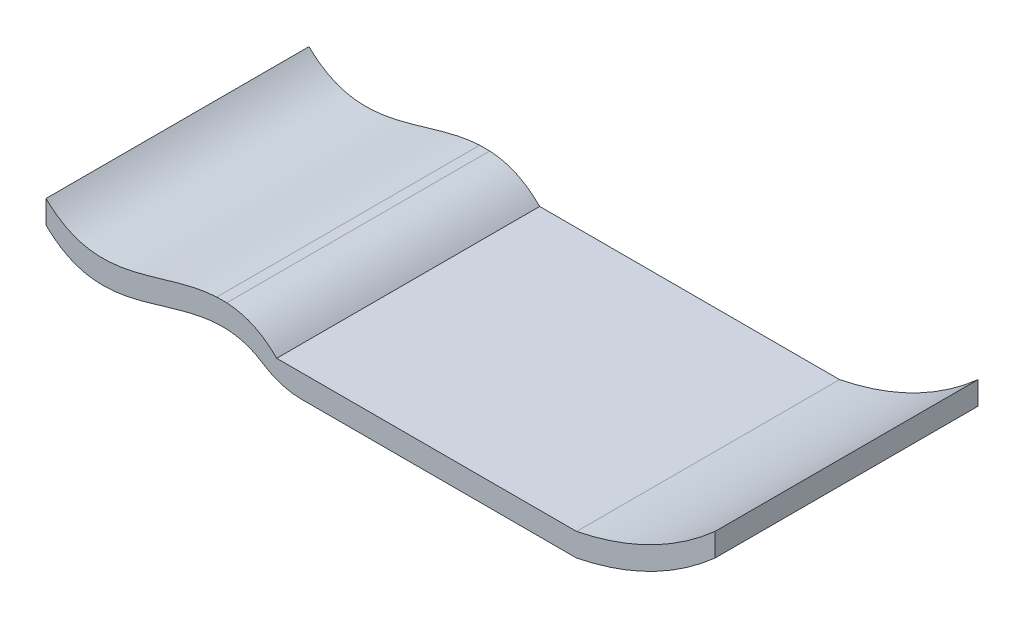
ISO-10303-21;
HEADER;
FILE_DESCRIPTION(('STEP AP214'),'2;1');
FILE_NAME('part.step','',(''),(''),'','','');
FILE_SCHEMA(('AUTOMOTIVE_DESIGN { 1 0 10303 214 1 1 1 1 }'));
ENDSEC;
DATA;
#1=APPLICATION_CONTEXT('core data for automotive mechanical design processes');
#2=APPLICATION_PROTOCOL_DEFINITION('international standard','automotive_design',2000,#1);
#3=PRODUCT_CONTEXT('',#1,'mechanical');
#4=PRODUCT('Part','Part','',(#3));
#5=PRODUCT_RELATED_PRODUCT_CATEGORY('part','',(#4));
#6=PRODUCT_DEFINITION_FORMATION('','',#4);
#7=PRODUCT_DEFINITION_CONTEXT('part definition',#1,'design');
#8=PRODUCT_DEFINITION('design','',#6,#7);
#9=PRODUCT_DEFINITION_SHAPE('','',#8);
#10=(LENGTH_UNIT() NAMED_UNIT(*) SI_UNIT(.MILLI.,.METRE.));
#11=(NAMED_UNIT(*) PLANE_ANGLE_UNIT() SI_UNIT($,.RADIAN.));
#12=(NAMED_UNIT(*) SI_UNIT($,.STERADIAN.) SOLID_ANGLE_UNIT());
#13=UNCERTAINTY_MEASURE_WITH_UNIT(LENGTH_MEASURE(1.E-05),#10,'distance_accuracy_value','');
#14=(GEOMETRIC_REPRESENTATION_CONTEXT(3) GLOBAL_UNCERTAINTY_ASSIGNED_CONTEXT((#13)) GLOBAL_UNIT_ASSIGNED_CONTEXT((#10,
#11,#12)) REPRESENTATION_CONTEXT('',''));
#15=CARTESIAN_POINT('',(0.,0.,0.));
#16=DIRECTION('',(0.,0.,1.));
#17=DIRECTION('',(1.,0.,0.));
#18=AXIS2_PLACEMENT_3D('',#15,#16,#17);
#19=CARTESIAN_POINT('',(0.,-5.,57.));
#20=CARTESIAN_POINT('',(-14.7624301242813,10.34831620414,57.));
#21=CARTESIAN_POINT('',(-34.295343774997,-15.48284378012,57.));
#22=CARTESIAN_POINT('',(-50.,0.,57.));
#23=B_SPLINE_CURVE_WITH_KNOTS('',3,(#19,#20,#21,#22),.UNSPECIFIED.,.F.,.F.,(4,4),(0.,1.),.UNSPECIFIED.);
#24=DIRECTION('',(0.,0.,-1.));
#25=VECTOR('',#24,1.);
#26=SURFACE_OF_LINEAR_EXTRUSION('',#23,#25);
#27=CARTESIAN_POINT('',(0.,-5.,0.));
#28=CARTESIAN_POINT('',(-14.7624301242813,10.34831620414,0.));
#29=CARTESIAN_POINT('',(-34.295343774997,-15.48284378012,0.));
#30=CARTESIAN_POINT('',(-50.,0.,0.));
#31=B_SPLINE_CURVE_WITH_KNOTS('',3,(#27,#28,#29,#30),.UNSPECIFIED.,.F.,.F.,(4,4),(0.,1.),.UNSPECIFIED.);
#32=CARTESIAN_POINT('',(-2.98901661872686,-2.471313430449,0.));
#33=VERTEX_POINT('',#32);
#34=CARTESIAN_POINT('',(-50.,0.,0.));
#35=VERTEX_POINT('',#34);
#36=EDGE_CURVE('E211',#33,#35,#31,.T.);
#37=ORIENTED_EDGE('',*,*,#36,.F.);
#38=DIRECTION('',(0.,0.,-1.));
#39=VECTOR('',#38,1.);
#40=CARTESIAN_POINT('',(-2.98901661872712,-2.47131343044883,0.));
#41=LINE('',#40,#39);
#42=CARTESIAN_POINT('',(-2.98901661872686,-2.471313430449,57.));
#43=VERTEX_POINT('',#42);
#44=EDGE_CURVE('E50',#33,#43,#41,.F.);
#45=ORIENTED_EDGE('',*,*,#44,.T.);
#46=CARTESIAN_POINT('',(-50.,0.,57.));
#47=VERTEX_POINT('',#46);
#48=EDGE_CURVE('E133',#43,#47,#23,.T.);
#49=ORIENTED_EDGE('',*,*,#48,.T.);
#50=DIRECTION('',(0.,0.,-1.));
#51=VECTOR('',#50,1.);
#52=CARTESIAN_POINT('',(-50.,0.,57.));
#53=LINE('',#52,#51);
#54=EDGE_CURVE('E188',#47,#35,#53,.T.);
#55=ORIENTED_EDGE('',*,*,#54,.T.);
#56=EDGE_LOOP('',(#37,#45,#49,#55));
#57=FACE_BOUND('',#56,.T.);
#58=ADVANCED_FACE('F42',(#57),#26,.T.);
#59=CARTESIAN_POINT('',(0.,-5.,57.));
#60=DIRECTION('',(0.,1.,0.));
#61=DIRECTION('',(0.,0.,1.));
#62=AXIS2_PLACEMENT_3D('',#59,#60,#61);
#63=PLANE('',#62);
#64=DIRECTION('',(1.,0.,0.));
#65=VECTOR('',#64,1.);
#66=CARTESIAN_POINT('',(0.,-5.,57.));
#67=LINE('',#66,#65);
#68=CARTESIAN_POINT('',(5.34563042356007,-5.,57.));
#69=VERTEX_POINT('',#68);
#70=CARTESIAN_POINT('',(65.,-5.,57.));
#71=VERTEX_POINT('',#70);
#72=EDGE_CURVE('E122',#69,#71,#67,.T.);
#73=ORIENTED_EDGE('',*,*,#72,.F.);
#74=DIRECTION('',(0.,0.,1.));
#75=VECTOR('',#74,1.);
#76=CARTESIAN_POINT('',(5.34563042356007,-5.,0.));
#77=LINE('',#76,#75);
#78=CARTESIAN_POINT('',(5.34563042356007,-5.,0.));
#79=VERTEX_POINT('',#78);
#80=EDGE_CURVE('E142',#69,#79,#77,.F.);
#81=ORIENTED_EDGE('',*,*,#80,.T.);
#82=DIRECTION('',(1.,0.,0.));
#83=VECTOR('',#82,1.);
#84=CARTESIAN_POINT('',(0.,-5.,0.));
#85=LINE('',#84,#83);
#86=CARTESIAN_POINT('',(65.,-5.,0.));
#87=VERTEX_POINT('',#86);
#88=EDGE_CURVE('E138',#79,#87,#85,.T.);
#89=ORIENTED_EDGE('',*,*,#88,.T.);
#90=DIRECTION('',(0.,0.,-1.));
#91=VECTOR('',#90,1.);
#92=CARTESIAN_POINT('',(65.,-5.,57.));
#93=LINE('',#92,#91);
#94=EDGE_CURVE('E136',#71,#87,#93,.T.);
#95=ORIENTED_EDGE('',*,*,#94,.F.);
#96=EDGE_LOOP('',(#73,#81,#89,#95));
#97=FACE_BOUND('',#96,.T.);
#98=ADVANCED_FACE('F137',(#97),#63,.F.);
#99=CARTESIAN_POINT('',(65.,-5.,57.));
#100=CARTESIAN_POINT('',(81.9733805434408,-1.5348515337873,57.));
#101=CARTESIAN_POINT('',(95.,10.,57.));
#102=B_SPLINE_CURVE_WITH_KNOTS('',2,(#99,#100,#101),.UNSPECIFIED.,.F.,.F.,(3,3),(0.,1.),.UNSPECIFIED.);
#103=DIRECTION('',(0.,0.,-1.));
#104=VECTOR('',#103,1.);
#105=SURFACE_OF_LINEAR_EXTRUSION('',#102,#104);
#106=CARTESIAN_POINT('',(65.,-5.,0.));
#107=CARTESIAN_POINT('',(81.9733805434408,-1.5348515337873,0.));
#108=CARTESIAN_POINT('',(95.,10.,0.));
#109=B_SPLINE_CURVE_WITH_KNOTS('',2,(#106,#107,#108),.UNSPECIFIED.,.F.,.F.,(3,3),(0.,1.),.UNSPECIFIED.);
#110=CARTESIAN_POINT('',(95.,10.,0.));
#111=VERTEX_POINT('',#110);
#112=EDGE_CURVE('E210',#87,#111,#109,.T.);
#113=ORIENTED_EDGE('',*,*,#112,.T.);
#114=DIRECTION('',(0.,0.,-1.));
#115=VECTOR('',#114,1.);
#116=CARTESIAN_POINT('',(95.,10.,57.));
#117=LINE('',#116,#115);
#118=CARTESIAN_POINT('',(95.,10.,57.));
#119=VERTEX_POINT('',#118);
#120=EDGE_CURVE('E143',#119,#111,#117,.T.);
#121=ORIENTED_EDGE('',*,*,#120,.F.);
#122=EDGE_CURVE('E127',#71,#119,#102,.T.);
#123=ORIENTED_EDGE('',*,*,#122,.F.);
#124=ORIENTED_EDGE('',*,*,#94,.T.);
#125=EDGE_LOOP('',(#113,#121,#123,#124));
#126=FACE_BOUND('',#125,.T.);
#127=ADVANCED_FACE('F145',(#126),#105,.F.);
#128=CARTESIAN_POINT('',(95.,0.,57.));
#129=DIRECTION('',(1.,0.,0.));
#130=DIRECTION('',(0.,0.,-1.));
#131=AXIS2_PLACEMENT_3D('',#128,#129,#130);
#132=PLANE('',#131);
#133=DIRECTION('',(0.,-1.,0.));
#134=VECTOR('',#133,1.);
#135=CARTESIAN_POINT('',(95.,0.,0.));
#136=LINE('',#135,#134);
#137=CARTESIAN_POINT('',(95.,15.,0.));
#138=VERTEX_POINT('',#137);
#139=EDGE_CURVE('E213',#138,#111,#136,.T.);
#140=ORIENTED_EDGE('',*,*,#139,.F.);
#141=DIRECTION('',(0.,0.,-1.));
#142=VECTOR('',#141,1.);
#143=CARTESIAN_POINT('',(95.,15.,57.));
#144=LINE('',#143,#142);
#145=CARTESIAN_POINT('',(95.,15.,57.));
#146=VERTEX_POINT('',#145);
#147=EDGE_CURVE('E203',#146,#138,#144,.T.);
#148=ORIENTED_EDGE('',*,*,#147,.F.);
#149=DIRECTION('',(0.,-1.,0.));
#150=VECTOR('',#149,1.);
#151=CARTESIAN_POINT('',(95.,0.,57.));
#152=LINE('',#151,#150);
#153=EDGE_CURVE('E147',#146,#119,#152,.T.);
#154=ORIENTED_EDGE('',*,*,#153,.T.);
#155=ORIENTED_EDGE('',*,*,#120,.T.);
#156=EDGE_LOOP('',(#140,#148,#154,#155));
#157=FACE_BOUND('',#156,.T.);
#158=ADVANCED_FACE('F163',(#157),#132,.T.);
#159=CARTESIAN_POINT('',(65.,0.,57.));
#160=CARTESIAN_POINT('',(81.9733805434408,3.4651484662127,57.));
#161=CARTESIAN_POINT('',(95.,15.,57.));
#162=B_SPLINE_CURVE_WITH_KNOTS('',2,(#159,#160,#161),.UNSPECIFIED.,.F.,.F.,(3,3),(0.,1.),.UNSPECIFIED.);
#163=DIRECTION('',(0.,0.,-1.));
#164=VECTOR('',#163,1.);
#165=SURFACE_OF_LINEAR_EXTRUSION('',#162,#164);
#166=CARTESIAN_POINT('',(65.,0.,0.));
#167=CARTESIAN_POINT('',(81.9733805434408,3.4651484662127,0.));
#168=CARTESIAN_POINT('',(95.,15.,0.));
#169=B_SPLINE_CURVE_WITH_KNOTS('',2,(#166,#167,#168),.UNSPECIFIED.,.F.,.F.,(3,3),(0.,1.),.UNSPECIFIED.);
#170=CARTESIAN_POINT('',(65.,0.,0.));
#171=VERTEX_POINT('',#170);
#172=EDGE_CURVE('E226',#171,#138,#169,.T.);
#173=ORIENTED_EDGE('',*,*,#172,.F.);
#174=DIRECTION('',(0.,0.,-1.));
#175=VECTOR('',#174,1.);
#176=CARTESIAN_POINT('',(65.,0.,57.));
#177=LINE('',#176,#175);
#178=CARTESIAN_POINT('',(65.,0.,57.));
#179=VERTEX_POINT('',#178);
#180=EDGE_CURVE('E201',#179,#171,#177,.T.);
#181=ORIENTED_EDGE('',*,*,#180,.F.);
#182=EDGE_CURVE('E149',#179,#146,#162,.T.);
#183=ORIENTED_EDGE('',*,*,#182,.T.);
#184=ORIENTED_EDGE('',*,*,#147,.T.);
#185=EDGE_LOOP('',(#173,#181,#183,#184));
#186=FACE_BOUND('',#185,.T.);
#187=ADVANCED_FACE('F279',(#186),#165,.T.);
#188=CARTESIAN_POINT('',(0.,0.,57.));
#189=DIRECTION('',(0.,1.,0.));
#190=DIRECTION('',(0.,0.,1.));
#191=AXIS2_PLACEMENT_3D('',#188,#189,#190);
#192=PLANE('',#191);
#193=DIRECTION('',(1.,0.,0.));
#194=VECTOR('',#193,1.);
#195=CARTESIAN_POINT('',(0.,0.,0.));
#196=LINE('',#195,#194);
#197=CARTESIAN_POINT('',(0.,0.,0.));
#198=VERTEX_POINT('',#197);
#199=EDGE_CURVE('E231',#198,#171,#196,.T.);
#200=ORIENTED_EDGE('',*,*,#199,.F.);
#201=DIRECTION('',(0.,0.,-1.));
#202=VECTOR('',#201,1.);
#203=CARTESIAN_POINT('',(0.,0.,57.));
#204=LINE('',#203,#202);
#205=CARTESIAN_POINT('',(0.,0.,57.));
#206=VERTEX_POINT('',#205);
#207=EDGE_CURVE('E199',#206,#198,#204,.T.);
#208=ORIENTED_EDGE('',*,*,#207,.F.);
#209=DIRECTION('',(1.,0.,0.));
#210=VECTOR('',#209,1.);
#211=CARTESIAN_POINT('',(0.,0.,57.));
#212=LINE('',#211,#210);
#213=EDGE_CURVE('E265',#206,#179,#212,.T.);
#214=ORIENTED_EDGE('',*,*,#213,.T.);
#215=ORIENTED_EDGE('',*,*,#180,.T.);
#216=EDGE_LOOP('',(#200,#208,#214,#215));
#217=FACE_BOUND('',#216,.T.);
#218=ADVANCED_FACE('F277',(#217),#192,.T.);
#219=CARTESIAN_POINT('',(0.,0.,57.));
#220=CARTESIAN_POINT('',(-15.0428525056975,15.1501864439706,57.));
#221=CARTESIAN_POINT('',(-34.3267970058822,-10.2469348174445,57.));
#222=CARTESIAN_POINT('',(-50.,5.,57.));
#223=B_SPLINE_CURVE_WITH_KNOTS('',3,(#219,#220,#221,#222),.UNSPECIFIED.,.F.,.F.,(4,4),(0.,1.),.UNSPECIFIED.);
#224=DIRECTION('',(0.,0.,-1.));
#225=VECTOR('',#224,1.);
#226=SURFACE_OF_LINEAR_EXTRUSION('',#223,#225);
#227=CARTESIAN_POINT('',(0.,0.,0.));
#228=CARTESIAN_POINT('',(-15.0428525056975,15.1501864439706,0.));
#229=CARTESIAN_POINT('',(-34.3267970058822,-10.2469348174445,0.));
#230=CARTESIAN_POINT('',(-50.,5.,0.));
#231=B_SPLINE_CURVE_WITH_KNOTS('',3,(#227,#228,#229,#230),.UNSPECIFIED.,.F.,.F.,(4,4),(0.,1.),.UNSPECIFIED.);
#232=CARTESIAN_POINT('',(-10.8279744124819,5.,0.));
#233=VERTEX_POINT('',#232);
#234=EDGE_CURVE('E185',#198,#233,#231,.T.);
#235=ORIENTED_EDGE('',*,*,#234,.T.);
#236=DIRECTION('',(0.,0.,-1.));
#237=VECTOR('',#236,1.);
#238=CARTESIAN_POINT('',(-10.8279744124819,5.,57.));
#239=LINE('',#238,#237);
#240=CARTESIAN_POINT('',(-10.8279744124819,5.,57.));
#241=VERTEX_POINT('',#240);
#242=EDGE_CURVE('E196',#241,#233,#239,.T.);
#243=ORIENTED_EDGE('',*,*,#242,.F.);
#244=EDGE_CURVE('E259',#206,#241,#223,.T.);
#245=ORIENTED_EDGE('',*,*,#244,.F.);
#246=ORIENTED_EDGE('',*,*,#207,.T.);
#247=EDGE_LOOP('',(#235,#243,#245,#246));
#248=FACE_BOUND('',#247,.T.);
#249=ADVANCED_FACE('F273',(#248),#226,.F.);
#250=CARTESIAN_POINT('',(0.,5.,57.));
#251=DIRECTION('',(0.,-1.,0.));
#252=DIRECTION('',(1.,0.,0.));
#253=AXIS2_PLACEMENT_3D('',#250,#251,#252);
#254=PLANE('',#253);
#255=DIRECTION('',(-1.,0.,0.));
#256=VECTOR('',#255,1.);
#257=CARTESIAN_POINT('',(0.,5.,0.));
#258=LINE('',#257,#256);
#259=CARTESIAN_POINT('',(-12.9984105520072,5.,0.));
#260=VERTEX_POINT('',#259);
#261=EDGE_CURVE('E183',#233,#260,#258,.T.);
#262=ORIENTED_EDGE('',*,*,#261,.T.);
#263=DIRECTION('',(0.,0.,-1.));
#264=VECTOR('',#263,1.);
#265=CARTESIAN_POINT('',(-12.9984105520072,5.,57.));
#266=LINE('',#265,#264);
#267=CARTESIAN_POINT('',(-12.9984105520072,5.,57.));
#268=VERTEX_POINT('',#267);
#269=EDGE_CURVE('E193',#268,#260,#266,.T.);
#270=ORIENTED_EDGE('',*,*,#269,.F.);
#271=DIRECTION('',(-1.,0.,0.));
#272=VECTOR('',#271,1.);
#273=CARTESIAN_POINT('',(0.,5.,57.));
#274=LINE('',#273,#272);
#275=EDGE_CURVE('E257',#241,#268,#274,.T.);
#276=ORIENTED_EDGE('',*,*,#275,.F.);
#277=ORIENTED_EDGE('',*,*,#242,.T.);
#278=EDGE_LOOP('',(#262,#270,#276,#277));
#279=FACE_BOUND('',#278,.T.);
#280=ADVANCED_FACE('F247',(#279),#254,.F.);
#281=CARTESIAN_POINT('',(-50.,5.,0.));
#282=VERTEX_POINT('',#281);
#283=EDGE_CURVE('E177',#260,#282,#231,.T.);
#284=ORIENTED_EDGE('',*,*,#283,.T.);
#285=DIRECTION('',(0.,0.,-1.));
#286=VECTOR('',#285,1.);
#287=CARTESIAN_POINT('',(-50.,5.,57.));
#288=LINE('',#287,#286);
#289=CARTESIAN_POINT('',(-50.,5.,57.));
#290=VERTEX_POINT('',#289);
#291=EDGE_CURVE('E190',#290,#282,#288,.T.);
#292=ORIENTED_EDGE('',*,*,#291,.F.);
#293=EDGE_CURVE('E254',#268,#290,#223,.T.);
#294=ORIENTED_EDGE('',*,*,#293,.F.);
#295=ORIENTED_EDGE('',*,*,#269,.T.);
#296=EDGE_LOOP('',(#284,#292,#294,#295));
#297=FACE_BOUND('',#296,.T.);
#298=ADVANCED_FACE('F252',(#297),#226,.F.);
#299=CARTESIAN_POINT('',(-50.,0.,57.));
#300=DIRECTION('',(1.,0.,0.));
#301=DIRECTION('',(0.,0.,-1.));
#302=AXIS2_PLACEMENT_3D('',#299,#300,#301);
#303=PLANE('',#302);
#304=DIRECTION('',(0.,-1.,0.));
#305=VECTOR('',#304,1.);
#306=CARTESIAN_POINT('',(-50.,0.,0.));
#307=LINE('',#306,#305);
#308=EDGE_CURVE('E170',#282,#35,#307,.T.);
#309=ORIENTED_EDGE('',*,*,#308,.T.);
#310=ORIENTED_EDGE('',*,*,#54,.F.);
#311=DIRECTION('',(0.,-1.,0.));
#312=VECTOR('',#311,1.);
#313=CARTESIAN_POINT('',(-50.,0.,57.));
#314=LINE('',#313,#312);
#315=EDGE_CURVE('E191',#290,#47,#314,.T.);
#316=ORIENTED_EDGE('',*,*,#315,.F.);
#317=ORIENTED_EDGE('',*,*,#291,.T.);
#318=EDGE_LOOP('',(#309,#310,#316,#317));
#319=FACE_BOUND('',#318,.T.);
#320=ADVANCED_FACE('F256',(#319),#303,.F.);
#321=CARTESIAN_POINT('',(0.,0.,57.));
#322=DIRECTION('',(0.,0.,1.));
#323=DIRECTION('',(1.,0.,0.));
#324=AXIS2_PLACEMENT_3D('',#321,#322,#323);
#325=PLANE('',#324);
#326=ORIENTED_EDGE('',*,*,#48,.F.);
#327=CARTESIAN_POINT('',(5.34563042356007,10.,57.));
#328=DIRECTION('',(0.,0.,1.));
#329=DIRECTION('',(1.,0.,0.));
#330=AXIS2_PLACEMENT_3D('',#327,#328,#329);
#331=CIRCLE('',#330,15.);
#332=EDGE_CURVE('E11',#43,#69,#331,.T.);
#333=ORIENTED_EDGE('',*,*,#332,.T.);
#334=ORIENTED_EDGE('',*,*,#72,.T.);
#335=ORIENTED_EDGE('',*,*,#122,.T.);
#336=ORIENTED_EDGE('',*,*,#153,.F.);
#337=ORIENTED_EDGE('',*,*,#182,.F.);
#338=ORIENTED_EDGE('',*,*,#213,.F.);
#339=ORIENTED_EDGE('',*,*,#244,.T.);
#340=ORIENTED_EDGE('',*,*,#275,.T.);
#341=ORIENTED_EDGE('',*,*,#293,.T.);
#342=ORIENTED_EDGE('',*,*,#315,.T.);
#343=EDGE_LOOP('',(#326,#333,#334,#335,#336,#337,#338,#339,#340,#341,#342));
#344=FACE_BOUND('',#343,.T.);
#345=ADVANCED_FACE('F124',(#344),#325,.T.);
#346=CARTESIAN_POINT('',(0.,0.,0.));
#347=DIRECTION('',(0.,0.,1.));
#348=DIRECTION('',(1.,0.,0.));
#349=AXIS2_PLACEMENT_3D('',#346,#347,#348);
#350=PLANE('',#349);
#351=ORIENTED_EDGE('',*,*,#88,.F.);
#352=CARTESIAN_POINT('',(5.34563042356007,10.,0.));
#353=DIRECTION('',(0.,0.,1.));
#354=DIRECTION('',(1.,0.,0.));
#355=AXIS2_PLACEMENT_3D('',#352,#353,#354);
#356=CIRCLE('',#355,15.);
#357=EDGE_CURVE('E64',#79,#33,#356,.F.);
#358=ORIENTED_EDGE('',*,*,#357,.T.);
#359=ORIENTED_EDGE('',*,*,#36,.T.);
#360=ORIENTED_EDGE('',*,*,#308,.F.);
#361=ORIENTED_EDGE('',*,*,#283,.F.);
#362=ORIENTED_EDGE('',*,*,#261,.F.);
#363=ORIENTED_EDGE('',*,*,#234,.F.);
#364=ORIENTED_EDGE('',*,*,#199,.T.);
#365=ORIENTED_EDGE('',*,*,#172,.T.);
#366=ORIENTED_EDGE('',*,*,#139,.T.);
#367=ORIENTED_EDGE('',*,*,#112,.F.);
#368=EDGE_LOOP('',(#351,#358,#359,#360,#361,#362,#363,#364,#365,#366,#367));
#369=FACE_BOUND('',#368,.T.);
#370=ADVANCED_FACE('F208',(#369),#350,.F.);
#371=CARTESIAN_POINT('',(5.34563042356007,10.,28.5));
#372=DIRECTION('',(0.,0.,-1.));
#373=DIRECTION('',(-1.,0.,0.));
#374=AXIS2_PLACEMENT_3D('',#371,#372,#373);
#375=CYLINDRICAL_SURFACE('',#374,15.);
#376=ORIENTED_EDGE('',*,*,#332,.F.);
#377=ORIENTED_EDGE('',*,*,#44,.F.);
#378=ORIENTED_EDGE('',*,*,#357,.F.);
#379=ORIENTED_EDGE('',*,*,#80,.F.);
#380=EDGE_LOOP('',(#376,#377,#378,#379));
#381=FACE_BOUND('',#380,.T.);
#382=ADVANCED_FACE('F44',(#381),#375,.T.);
#383=CLOSED_SHELL('',(#58,#98,#127,#158,#187,#218,#249,#280,#298,#320,#345,#370,#382));
#384=MANIFOLD_SOLID_BREP('B2',#383);
#385=ADVANCED_BREP_SHAPE_REPRESENTATION('',(#18,#384),#14);
#386=SHAPE_DEFINITION_REPRESENTATION(#9,#385);
ENDSEC;
END-ISO-10303-21;
